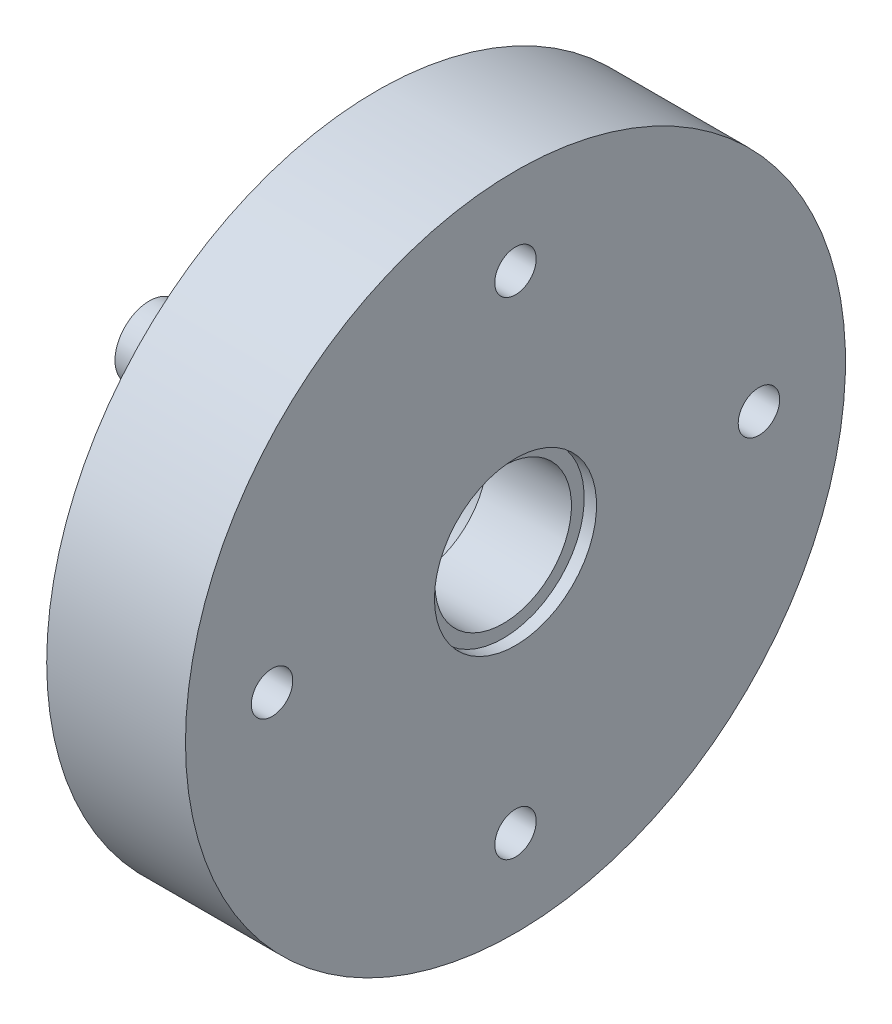
ISO-10303-21;
HEADER;
FILE_DESCRIPTION(('STEP AP214'),'2;1');
FILE_NAME('part.step','',(''),(''),'','','');
FILE_SCHEMA(('AUTOMOTIVE_DESIGN { 1 0 10303 214 1 1 1 1 }'));
ENDSEC;
DATA;
#1=APPLICATION_CONTEXT('core data for automotive mechanical design processes');
#2=APPLICATION_PROTOCOL_DEFINITION('international standard','automotive_design',2000,#1);
#3=PRODUCT_CONTEXT('',#1,'mechanical');
#4=PRODUCT('Part','Part','',(#3));
#5=PRODUCT_RELATED_PRODUCT_CATEGORY('part','',(#4));
#6=PRODUCT_DEFINITION_FORMATION('','',#4);
#7=PRODUCT_DEFINITION_CONTEXT('part definition',#1,'design');
#8=PRODUCT_DEFINITION('design','',#6,#7);
#9=PRODUCT_DEFINITION_SHAPE('','',#8);
#10=(LENGTH_UNIT() NAMED_UNIT(*) SI_UNIT(.MILLI.,.METRE.));
#11=(NAMED_UNIT(*) PLANE_ANGLE_UNIT() SI_UNIT($,.RADIAN.));
#12=(NAMED_UNIT(*) SI_UNIT($,.STERADIAN.) SOLID_ANGLE_UNIT());
#13=UNCERTAINTY_MEASURE_WITH_UNIT(LENGTH_MEASURE(1.E-05),#10,'distance_accuracy_value','');
#14=(GEOMETRIC_REPRESENTATION_CONTEXT(3) GLOBAL_UNCERTAINTY_ASSIGNED_CONTEXT((#13)) GLOBAL_UNIT_ASSIGNED_CONTEXT((#10,
#11,#12)) REPRESENTATION_CONTEXT('',''));
#15=CARTESIAN_POINT('',(0.,0.,0.));
#16=DIRECTION('',(0.,0.,1.));
#17=DIRECTION('',(1.,0.,0.));
#18=AXIS2_PLACEMENT_3D('',#15,#16,#17);
#19=CARTESIAN_POINT('',(-71.2918592683267,11.7141702218951,0.));
#20=DIRECTION('',(1.,0.,0.));
#21=DIRECTION('',(0.,0.,-1.));
#22=AXIS2_PLACEMENT_3D('',#19,#20,#21);
#23=CONICAL_SURFACE('',#22,3.17,0.0784901026373288);
#24=CARTESIAN_POINT('',(-75.7418592683269,11.7141702218951,0.));
#25=DIRECTION('',(-1.,0.,0.));
#26=DIRECTION('',(0.,0.,1.));
#27=AXIS2_PLACEMENT_3D('',#24,#25,#26);
#28=CIRCLE('',#27,2.82);
#29=CARTESIAN_POINT('',(-75.7418592683269,11.7141702218951,2.82));
#30=VERTEX_POINT('',#29);
#31=EDGE_CURVE('E91',#30,#30,#28,.T.);
#32=ORIENTED_EDGE('',*,*,#31,.F.);
#33=EDGE_LOOP('',(#32));
#34=FACE_BOUND('',#33,.T.);
#35=CARTESIAN_POINT('',(-71.2918592683267,11.7141702218951,0.));
#36=DIRECTION('',(-1.,0.,0.));
#37=DIRECTION('',(0.,0.,1.));
#38=AXIS2_PLACEMENT_3D('',#35,#36,#37);
#39=CIRCLE('',#38,3.17);
#40=CARTESIAN_POINT('',(-71.2918592683267,11.7141702218951,3.17));
#41=VERTEX_POINT('',#40);
#42=EDGE_CURVE('E10',#41,#41,#39,.T.);
#43=ORIENTED_EDGE('',*,*,#42,.T.);
#44=EDGE_LOOP('',(#43));
#45=FACE_BOUND('',#44,.T.);
#46=ADVANCED_FACE('F36',(#34,#45),#23,.T.);
#47=CARTESIAN_POINT('',(-71.2918592683267,14.8841702218951,0.));
#48=DIRECTION('',(-1.,0.,0.));
#49=DIRECTION('',(0.,0.,1.));
#50=AXIS2_PLACEMENT_3D('',#47,#48,#49);
#51=PLANE('',#50);
#52=ORIENTED_EDGE('',*,*,#42,.F.);
#53=EDGE_LOOP('',(#52));
#54=FACE_BOUND('',#53,.T.);
#55=CARTESIAN_POINT('',(-71.2918592683267,11.7141702218951,0.));
#56=DIRECTION('',(-1.,0.,0.));
#57=DIRECTION('',(0.,0.,1.));
#58=AXIS2_PLACEMENT_3D('',#55,#56,#57);
#59=CIRCLE('',#58,2.82);
#60=CARTESIAN_POINT('',(-71.2918592683267,11.7141702218951,2.82));
#61=VERTEX_POINT('',#60);
#62=EDGE_CURVE('E42',#61,#61,#59,.T.);
#63=ORIENTED_EDGE('',*,*,#62,.T.);
#64=EDGE_LOOP('',(#63));
#65=FACE_BOUND('',#64,.T.);
#66=ADVANCED_FACE('F223',(#54,#65),#51,.F.);
#67=CARTESIAN_POINT('',(-66.841859268327,11.7141702218951,0.));
#68=DIRECTION('',(1.,0.,0.));
#69=DIRECTION('',(0.,0.,-1.));
#70=AXIS2_PLACEMENT_3D('',#67,#68,#69);
#71=CONICAL_SURFACE('',#70,3.17,0.0784901026373366);
#72=ORIENTED_EDGE('',*,*,#62,.F.);
#73=EDGE_LOOP('',(#72));
#74=FACE_BOUND('',#73,.T.);
#75=CARTESIAN_POINT('',(-66.841859268327,11.7141702218951,0.));
#76=DIRECTION('',(-1.,0.,0.));
#77=DIRECTION('',(0.,0.,1.));
#78=AXIS2_PLACEMENT_3D('',#75,#76,#77);
#79=CIRCLE('',#78,3.17);
#80=CARTESIAN_POINT('',(-66.841859268327,11.7141702218951,3.17));
#81=VERTEX_POINT('',#80);
#82=EDGE_CURVE('E46',#81,#81,#79,.T.);
#83=ORIENTED_EDGE('',*,*,#82,.T.);
#84=EDGE_LOOP('',(#83));
#85=FACE_BOUND('',#84,.T.);
#86=ADVANCED_FACE('F227',(#74,#85),#71,.T.);
#87=CARTESIAN_POINT('',(-66.8418592683269,14.8841702218951,0.));
#88=DIRECTION('',(-1.,0.,0.));
#89=DIRECTION('',(0.,0.,1.));
#90=AXIS2_PLACEMENT_3D('',#87,#88,#89);
#91=PLANE('',#90);
#92=ORIENTED_EDGE('',*,*,#82,.F.);
#93=EDGE_LOOP('',(#92));
#94=FACE_BOUND('',#93,.T.);
#95=CARTESIAN_POINT('',(-66.841859268327,11.7141702218951,0.));
#96=DIRECTION('',(-1.,0.,0.));
#97=DIRECTION('',(0.,0.,1.));
#98=AXIS2_PLACEMENT_3D('',#95,#96,#97);
#99=CIRCLE('',#98,2.82);
#100=CARTESIAN_POINT('',(-66.841859268327,11.7141702218951,2.82));
#101=VERTEX_POINT('',#100);
#102=EDGE_CURVE('E50',#101,#101,#99,.T.);
#103=ORIENTED_EDGE('',*,*,#102,.T.);
#104=EDGE_LOOP('',(#103));
#105=FACE_BOUND('',#104,.T.);
#106=ADVANCED_FACE('F232',(#94,#105),#91,.F.);
#107=CARTESIAN_POINT('',(-62.3716094477877,11.7141702218951,0.));
#108=DIRECTION('',(1.,0.,0.));
#109=DIRECTION('',(0.,0.,-1.));
#110=AXIS2_PLACEMENT_3D('',#107,#108,#109);
#111=CONICAL_SURFACE('',#110,3.17,0.0781359983486207);
#112=ORIENTED_EDGE('',*,*,#102,.F.);
#113=EDGE_LOOP('',(#112));
#114=FACE_BOUND('',#113,.T.);
#115=CARTESIAN_POINT('',(-62.3716094477877,11.7141702218951,0.));
#116=DIRECTION('',(-1.,0.,0.));
#117=DIRECTION('',(0.,0.,1.));
#118=AXIS2_PLACEMENT_3D('',#115,#116,#117);
#119=CIRCLE('',#118,3.17);
#120=CARTESIAN_POINT('',(-62.3716094477877,11.7141702218951,3.17));
#121=VERTEX_POINT('',#120);
#122=EDGE_CURVE('E55',#121,#121,#119,.T.);
#123=ORIENTED_EDGE('',*,*,#122,.T.);
#124=EDGE_LOOP('',(#123));
#125=FACE_BOUND('',#124,.T.);
#126=ADVANCED_FACE('F238',(#114,#125),#111,.T.);
#127=CARTESIAN_POINT('',(-62.3716094477878,14.8841702218951,0.));
#128=DIRECTION('',(-1.,0.,0.));
#129=DIRECTION('',(0.,0.,1.));
#130=AXIS2_PLACEMENT_3D('',#127,#128,#129);
#131=PLANE('',#130);
#132=ORIENTED_EDGE('',*,*,#122,.F.);
#133=EDGE_LOOP('',(#132));
#134=FACE_BOUND('',#133,.T.);
#135=CARTESIAN_POINT('',(-62.3716094477877,11.7141702218951,0.));
#136=DIRECTION('',(-1.,0.,0.));
#137=DIRECTION('',(0.,0.,1.));
#138=AXIS2_PLACEMENT_3D('',#135,#136,#137);
#139=CIRCLE('',#138,2.82);
#140=CARTESIAN_POINT('',(-62.3716094477877,11.7141702218951,-2.82000000000001));
#141=VERTEX_POINT('',#140);
#142=EDGE_CURVE('E58',#141,#141,#139,.T.);
#143=ORIENTED_EDGE('',*,*,#142,.T.);
#144=EDGE_LOOP('',(#143));
#145=FACE_BOUND('',#144,.T.);
#146=ADVANCED_FACE('F242',(#134,#145),#131,.F.);
#147=CARTESIAN_POINT('',(-59.4889180755963,11.7141702218951,0.));
#148=DIRECTION('',(1.,0.,0.));
#149=DIRECTION('',(0.,0.,-1.));
#150=AXIS2_PLACEMENT_3D('',#147,#148,#149);
#151=CONICAL_SURFACE('',#150,12.0738754304226,1.2688119953633);
#152=CARTESIAN_POINT('',(-59.4889180755963,11.7141702218951,0.));
#153=DIRECTION('',(-1.,0.,0.));
#154=DIRECTION('',(0.,0.,1.));
#155=AXIS2_PLACEMENT_3D('',#152,#153,#154);
#156=CIRCLE('',#155,12.0738754304226);
#157=CARTESIAN_POINT('',(-59.4889180755963,11.7141702218951,-12.0738754304226));
#158=VERTEX_POINT('',#157);
#159=EDGE_CURVE('E61',#158,#158,#156,.T.);
#160=CARTESIAN_POINT('',(-62.3716094477877,11.7141702218951,-2.82000000000001));
#161=CARTESIAN_POINT('',(-62.3415814126608,11.7141702218951,-2.91639453573358));
#162=CARTESIAN_POINT('',(-62.3115533775338,11.7141702218951,-3.01278907146714));
#163=CARTESIAN_POINT('',(-62.2514973072798,11.7141702218951,-3.20557814293428));
#164=CARTESIAN_POINT('',(-62.2214692721528,11.7141702218951,-3.30197267866785));
#165=CARTESIAN_POINT('',(-62.1614132018988,11.7141702218951,-3.49476175013499));
#166=CARTESIAN_POINT('',(-62.1313851667718,11.7141702218951,-3.59115628586855));
#167=CARTESIAN_POINT('',(-62.0713290965178,11.7141702218951,-3.78394535733569));
#168=CARTESIAN_POINT('',(-62.0413010613908,11.7141702218951,-3.88033989306926));
#169=CARTESIAN_POINT('',(-61.9812449911368,11.7141702218951,-4.0731289645364));
#170=CARTESIAN_POINT('',(-61.9512169560098,11.7141702218951,-4.16952350026996));
#171=CARTESIAN_POINT('',(-61.8911608857558,11.7141702218951,-4.3623125717371));
#172=CARTESIAN_POINT('',(-61.8611328506288,11.7141702218951,-4.45870710747067));
#173=CARTESIAN_POINT('',(-61.8010767803748,11.7141702218951,-4.6514961789378));
#174=CARTESIAN_POINT('',(-61.7710487452479,11.7141702218951,-4.74789071467137));
#175=CARTESIAN_POINT('',(-61.7109926749939,11.7141702218951,-4.94067978613851));
#176=CARTESIAN_POINT('',(-61.6809646398669,11.7141702218951,-5.03707432187208));
#177=CARTESIAN_POINT('',(-61.6209085696129,11.7141702218951,-5.22986339333921));
#178=CARTESIAN_POINT('',(-61.5908805344859,11.7141702218951,-5.32625792907278));
#179=CARTESIAN_POINT('',(-61.5308244642319,11.7141702218951,-5.51904700053992));
#180=CARTESIAN_POINT('',(-61.5007964291049,11.7141702218951,-5.61544153627349));
#181=CARTESIAN_POINT('',(-61.4407403588509,11.7141702218951,-5.80823060774062));
#182=CARTESIAN_POINT('',(-61.4107123237239,11.7141702218951,-5.90462514347419));
#183=CARTESIAN_POINT('',(-61.3506562534699,11.7141702218951,-6.09741421494133));
#184=CARTESIAN_POINT('',(-61.3206282183429,11.7141702218951,-6.1938087506749));
#185=CARTESIAN_POINT('',(-61.260572148089,11.7141702218951,-6.38659782214203));
#186=CARTESIAN_POINT('',(-61.230544112962,11.7141702218951,-6.4829923578756));
#187=CARTESIAN_POINT('',(-61.170488042708,11.7141702218951,-6.67578142934274));
#188=CARTESIAN_POINT('',(-61.140460007581,11.7141702218951,-6.77217596507631));
#189=CARTESIAN_POINT('',(-61.080403937327,11.7141702218951,-6.96496503654344));
#190=CARTESIAN_POINT('',(-61.0503759022,11.7141702218951,-7.06135957227701));
#191=CARTESIAN_POINT('',(-60.990319831946,11.7141702218951,-7.25414864374415));
#192=CARTESIAN_POINT('',(-60.960291796819,11.7141702218951,-7.35054317947772));
#193=CARTESIAN_POINT('',(-60.900235726565,11.7141702218951,-7.54333225094485));
#194=CARTESIAN_POINT('',(-60.870207691438,11.7141702218951,-7.63972678667842));
#195=CARTESIAN_POINT('',(-60.810151621184,11.7141702218951,-7.83251585814556));
#196=CARTESIAN_POINT('',(-60.7801235860571,11.7141702218951,-7.92891039387913));
#197=CARTESIAN_POINT('',(-60.7200675158031,11.7141702218951,-8.12169946534626));
#198=CARTESIAN_POINT('',(-60.6900394806761,11.7141702218951,-8.21809400107983));
#199=CARTESIAN_POINT('',(-60.6299834104221,11.7141702218951,-8.41088307254697));
#200=CARTESIAN_POINT('',(-60.5999553752951,11.7141702218951,-8.50727760828054));
#201=CARTESIAN_POINT('',(-60.5398993050411,11.7141702218951,-8.70006667974767));
#202=CARTESIAN_POINT('',(-60.5098712699141,11.7141702218951,-8.79646121548124));
#203=CARTESIAN_POINT('',(-60.4498151996601,11.7141702218951,-8.98925028694838));
#204=CARTESIAN_POINT('',(-60.4197871645331,11.7141702218951,-9.08564482268195));
#205=CARTESIAN_POINT('',(-60.3597310942791,11.7141702218951,-9.27843389414908));
#206=CARTESIAN_POINT('',(-60.3297030591521,11.7141702218951,-9.37482842988265));
#207=CARTESIAN_POINT('',(-60.2696469888982,11.7141702218951,-9.56761750134979));
#208=CARTESIAN_POINT('',(-60.2396189537712,11.7141702218951,-9.66401203708335));
#209=CARTESIAN_POINT('',(-60.1795628835172,11.7141702218951,-9.85680110855049));
#210=CARTESIAN_POINT('',(-60.1495348483902,11.7141702218951,-9.95319564428406));
#211=CARTESIAN_POINT('',(-60.0894787781362,11.7141702218951,-10.1459847157512));
#212=CARTESIAN_POINT('',(-60.0594507430092,11.7141702218951,-10.2423792514848));
#213=CARTESIAN_POINT('',(-59.9993946727552,11.7141702218951,-10.4351683229519));
#214=CARTESIAN_POINT('',(-59.9693666376282,11.7141702218951,-10.5315628586855));
#215=CARTESIAN_POINT('',(-59.9093105673742,11.7141702218951,-10.7243519301526));
#216=CARTESIAN_POINT('',(-59.8792825322472,11.7141702218951,-10.8207464658862));
#217=CARTESIAN_POINT('',(-59.8192264619932,11.7141702218951,-11.0135355373533));
#218=CARTESIAN_POINT('',(-59.7891984268662,11.7141702218951,-11.1099300730869));
#219=CARTESIAN_POINT('',(-59.7291423566123,11.7141702218951,-11.302719144554));
#220=CARTESIAN_POINT('',(-59.6991143214853,11.7141702218951,-11.3991136802876));
#221=CARTESIAN_POINT('',(-59.6390582512313,11.7141702218951,-11.5919027517547));
#222=CARTESIAN_POINT('',(-59.6090302161043,11.7141702218951,-11.6882972874883));
#223=CARTESIAN_POINT('',(-59.5489741458503,11.7141702218951,-11.8810863589554));
#224=CARTESIAN_POINT('',(-59.5189461107233,11.7141702218951,-11.977480894689));
#225=CARTESIAN_POINT('',(-59.4889180755963,11.7141702218951,-12.0738754304226));
#226=B_SPLINE_CURVE_WITH_KNOTS('',3,(#160,#161,#162,#163,#164,#165,#166,#167,#168,#169,#170,
#171,#172,#173,#174,#175,#176,#177,#178,#179,#180,#181,#182,#183,#184,#185,#186,#187,#188,#189,
#190,#191,#192,#193,#194,#195,#196,#197,#198,#199,#200,#201,#202,#203,#204,#205,#206,#207,#208,
#209,#210,#211,#212,#213,#214,#215,#216,#217,#218,#219,#220,#221,#222,#223,#224,#225),
.UNSPECIFIED.,.F.,.F.,(4,2,2,2,2,2,2,2,2,2,2,2,2,2,2,2,2,2,2,2,2,2,2,2,2,2,2,2,2,2,2,2,4),(0.,
0.302889921780016,0.605779843560032,0.908669765340045,1.21155968712006,1.51444960890007,
1.81733953068009,2.1202294524601,2.42311937424012,2.72600929602013,3.02889921780015,
3.33178913958016,3.63467906136018,3.93756898314019,4.24045890492021,4.54334882670022,
4.84623874848024,5.14912867026025,5.45201859204027,5.75490851382028,6.0577984356003,
6.36068835738031,6.66357827916033,6.96646820094034,7.26935812272036,7.57224804450037,
7.87513796628039,8.1780278880604,8.48091780984041,8.78380773162043,9.08669765340045,
9.38958757518046,9.69247749696047),.UNSPECIFIED.);
#227=EDGE_CURVE('BSEAM246',#141,#158,#226,.T.);
#228=ORIENTED_EDGE('',*,*,#142,.F.);
#229=ORIENTED_EDGE('',*,*,#159,.T.);
#230=ORIENTED_EDGE('',*,*,#227,.T.);
#231=ORIENTED_EDGE('',*,*,#227,.F.);
#232=EDGE_LOOP('',(#228,#230,#229,#231));
#233=FACE_BOUND('',#232,.T.);
#234=ADVANCED_FACE('F246',(#233),#151,.T.);
#235=CARTESIAN_POINT('',(-795.163849312577,11.7141702218951,0.));
#236=DIRECTION('',(-1.,0.,0.));
#237=DIRECTION('',(0.,0.,1.));
#238=AXIS2_PLACEMENT_3D('',#235,#236,#237);
#239=CYLINDRICAL_SURFACE('',#238,12.0738754304226);
#240=ORIENTED_EDGE('',*,*,#159,.F.);
#241=EDGE_LOOP('',(#240));
#242=FACE_BOUND('',#241,.T.);
#243=CARTESIAN_POINT('',(-57.0912148072447,11.7141702218951,0.));
#244=DIRECTION('',(-1.,0.,0.));
#245=DIRECTION('',(0.,0.,1.));
#246=AXIS2_PLACEMENT_3D('',#243,#244,#245);
#247=CIRCLE('',#246,12.0738754304226);
#248=CARTESIAN_POINT('',(-57.0912148072447,11.7141702218951,12.0738754304226));
#249=VERTEX_POINT('',#248);
#250=EDGE_CURVE('E64',#249,#249,#247,.T.);
#251=ORIENTED_EDGE('',*,*,#250,.T.);
#252=EDGE_LOOP('',(#251));
#253=FACE_BOUND('',#252,.T.);
#254=ADVANCED_FACE('F161',(#242,#253),#239,.T.);
#255=CARTESIAN_POINT('',(-57.0912148072447,38.7880456523176,0.));
#256=DIRECTION('',(1.,0.,0.));
#257=DIRECTION('',(0.,0.,-1.));
#258=AXIS2_PLACEMENT_3D('',#255,#256,#257);
#259=PLANE('',#258);
#260=CARTESIAN_POINT('',(-57.0912148072447,31.6852610835262,0.));
#261=DIRECTION('',(-1.,0.,0.));
#262=DIRECTION('',(0.,0.,1.));
#263=AXIS2_PLACEMENT_3D('',#260,#261,#262);
#264=CIRCLE('',#263,3.275);
#265=CARTESIAN_POINT('',(-57.0912148072447,31.6852610835262,3.275));
#266=VERTEX_POINT('',#265);
#267=EDGE_CURVE('E151',#266,#266,#264,.T.);
#268=ORIENTED_EDGE('',*,*,#267,.F.);
#269=EDGE_LOOP('',(#268));
#270=FACE_BOUND('',#269,.T.);
#271=CARTESIAN_POINT('',(-57.0912148072447,11.7141702218951,19.9710908616312));
#272=DIRECTION('',(-1.,0.,0.));
#273=DIRECTION('',(0.,0.,1.));
#274=AXIS2_PLACEMENT_3D('',#271,#272,#273);
#275=CIRCLE('',#274,3.275);
#276=CARTESIAN_POINT('',(-57.0912148072447,11.7141702218951,23.2460908616312));
#277=VERTEX_POINT('',#276);
#278=EDGE_CURVE('E136',#277,#277,#275,.T.);
#279=ORIENTED_EDGE('',*,*,#278,.F.);
#280=EDGE_LOOP('',(#279));
#281=FACE_BOUND('',#280,.T.);
#282=CARTESIAN_POINT('',(-57.0912148072447,-8.25692063973612,0.));
#283=DIRECTION('',(-1.,0.,0.));
#284=DIRECTION('',(0.,0.,1.));
#285=AXIS2_PLACEMENT_3D('',#282,#283,#284);
#286=CIRCLE('',#285,3.275);
#287=CARTESIAN_POINT('',(-57.0912148072447,-8.25692063973612,3.275));
#288=VERTEX_POINT('',#287);
#289=EDGE_CURVE('E121',#288,#288,#286,.T.);
#290=ORIENTED_EDGE('',*,*,#289,.F.);
#291=EDGE_LOOP('',(#290));
#292=FACE_BOUND('',#291,.T.);
#293=CARTESIAN_POINT('',(-57.0912148072447,11.7141702218951,-19.9710908616312));
#294=DIRECTION('',(-1.,0.,0.));
#295=DIRECTION('',(0.,0.,1.));
#296=AXIS2_PLACEMENT_3D('',#293,#294,#295);
#297=CIRCLE('',#296,3.275);
#298=CARTESIAN_POINT('',(-57.0912148072447,11.7141702218951,-16.6960908616312));
#299=VERTEX_POINT('',#298);
#300=EDGE_CURVE('E106',#299,#299,#297,.T.);
#301=ORIENTED_EDGE('',*,*,#300,.F.);
#302=EDGE_LOOP('',(#301));
#303=FACE_BOUND('',#302,.T.);
#304=ORIENTED_EDGE('',*,*,#250,.F.);
#305=EDGE_LOOP('',(#304));
#306=FACE_BOUND('',#305,.T.);
#307=CARTESIAN_POINT('',(-57.0912148072447,11.7141702218951,0.));
#308=DIRECTION('',(-1.,0.,0.));
#309=DIRECTION('',(0.,0.,1.));
#310=AXIS2_PLACEMENT_3D('',#307,#308,#309);
#311=CIRCLE('',#310,27.0738754304226);
#312=CARTESIAN_POINT('',(-57.0912148072447,11.7141702218951,27.0738754304226));
#313=VERTEX_POINT('',#312);
#314=EDGE_CURVE('E67',#313,#313,#311,.T.);
#315=ORIENTED_EDGE('',*,*,#314,.T.);
#316=EDGE_LOOP('',(#315));
#317=FACE_BOUND('',#316,.T.);
#318=ADVANCED_FACE('F157',(#270,#281,#292,#303,#306,#317),#259,.F.);
#319=CARTESIAN_POINT('',(-795.163849312577,11.7141702218951,0.));
#320=DIRECTION('',(-1.,0.,0.));
#321=DIRECTION('',(0.,0.,1.));
#322=AXIS2_PLACEMENT_3D('',#319,#320,#321);
#323=CYLINDRICAL_SURFACE('',#322,27.0738754304226);
#324=ORIENTED_EDGE('',*,*,#314,.F.);
#325=EDGE_LOOP('',(#324));
#326=FACE_BOUND('',#325,.T.);
#327=CARTESIAN_POINT('',(-45.7058116481793,11.7141702218951,0.));
#328=DIRECTION('',(-1.,0.,0.));
#329=DIRECTION('',(0.,0.,1.));
#330=AXIS2_PLACEMENT_3D('',#327,#328,#329);
#331=CIRCLE('',#330,27.0738754304226);
#332=CARTESIAN_POINT('',(-45.7058116481793,11.7141702218951,27.0738754304226));
#333=VERTEX_POINT('',#332);
#334=EDGE_CURVE('E70',#333,#333,#331,.T.);
#335=ORIENTED_EDGE('',*,*,#334,.T.);
#336=EDGE_LOOP('',(#335));
#337=FACE_BOUND('',#336,.T.);
#338=ADVANCED_FACE('F160',(#326,#337),#323,.T.);
#339=CARTESIAN_POINT('',(-45.7058116481793,19.977485581554,0.));
#340=DIRECTION('',(-1.,0.,0.));
#341=DIRECTION('',(0.,0.,1.));
#342=AXIS2_PLACEMENT_3D('',#339,#340,#341);
#343=PLANE('',#342);
#344=CARTESIAN_POINT('',(-45.7058116481793,31.6852610835262,0.));
#345=DIRECTION('',(-1.,0.,0.));
#346=DIRECTION('',(0.,0.,1.));
#347=AXIS2_PLACEMENT_3D('',#344,#345,#346);
#348=CIRCLE('',#347,1.7);
#349=CARTESIAN_POINT('',(-45.7058116481793,31.6852610835262,1.7));
#350=VERTEX_POINT('',#349);
#351=EDGE_CURVE('E139',#350,#350,#348,.T.);
#352=ORIENTED_EDGE('',*,*,#351,.T.);
#353=EDGE_LOOP('',(#352));
#354=FACE_BOUND('',#353,.T.);
#355=CARTESIAN_POINT('',(-45.7058116481793,11.7141702218951,19.9710908616312));
#356=DIRECTION('',(-1.,0.,0.));
#357=DIRECTION('',(0.,0.,1.));
#358=AXIS2_PLACEMENT_3D('',#355,#356,#357);
#359=CIRCLE('',#358,1.7);
#360=CARTESIAN_POINT('',(-45.7058116481793,11.7141702218951,21.6710908616312));
#361=VERTEX_POINT('',#360);
#362=EDGE_CURVE('E124',#361,#361,#359,.T.);
#363=ORIENTED_EDGE('',*,*,#362,.T.);
#364=EDGE_LOOP('',(#363));
#365=FACE_BOUND('',#364,.T.);
#366=CARTESIAN_POINT('',(-45.7058116481793,-8.25692063973612,0.));
#367=DIRECTION('',(-1.,0.,0.));
#368=DIRECTION('',(0.,0.,1.));
#369=AXIS2_PLACEMENT_3D('',#366,#367,#368);
#370=CIRCLE('',#369,1.7);
#371=CARTESIAN_POINT('',(-45.7058116481793,-8.25692063973612,1.7));
#372=VERTEX_POINT('',#371);
#373=EDGE_CURVE('E109',#372,#372,#370,.T.);
#374=ORIENTED_EDGE('',*,*,#373,.T.);
#375=EDGE_LOOP('',(#374));
#376=FACE_BOUND('',#375,.T.);
#377=CARTESIAN_POINT('',(-45.7058116481793,11.7141702218951,-19.9710908616312));
#378=DIRECTION('',(-1.,0.,0.));
#379=DIRECTION('',(0.,0.,1.));
#380=AXIS2_PLACEMENT_3D('',#377,#378,#379);
#381=CIRCLE('',#380,1.7);
#382=CARTESIAN_POINT('',(-45.7058116481793,11.7141702218951,-18.2710908616312));
#383=VERTEX_POINT('',#382);
#384=EDGE_CURVE('E94',#383,#383,#381,.T.);
#385=ORIENTED_EDGE('',*,*,#384,.T.);
#386=EDGE_LOOP('',(#385));
#387=FACE_BOUND('',#386,.T.);
#388=ORIENTED_EDGE('',*,*,#334,.F.);
#389=EDGE_LOOP('',(#388));
#390=FACE_BOUND('',#389,.T.);
#391=CARTESIAN_POINT('',(-45.7058116481793,11.7141702218951,0.));
#392=DIRECTION('',(-1.,0.,0.));
#393=DIRECTION('',(0.,0.,1.));
#394=AXIS2_PLACEMENT_3D('',#391,#392,#393);
#395=CIRCLE('',#394,6.65);
#396=CARTESIAN_POINT('',(-45.7058116481793,11.7141702218951,6.65));
#397=VERTEX_POINT('',#396);
#398=EDGE_CURVE('E73',#397,#397,#395,.T.);
#399=ORIENTED_EDGE('',*,*,#398,.T.);
#400=EDGE_LOOP('',(#399));
#401=FACE_BOUND('',#400,.T.);
#402=ADVANCED_FACE('F175',(#354,#365,#376,#387,#390,#401),#343,.F.);
#403=CARTESIAN_POINT('',(-795.163849312577,11.7141702218951,0.));
#404=DIRECTION('',(-1.,0.,0.));
#405=DIRECTION('',(0.,0.,1.));
#406=AXIS2_PLACEMENT_3D('',#403,#404,#405);
#407=CYLINDRICAL_SURFACE('',#406,6.65);
#408=ORIENTED_EDGE('',*,*,#398,.F.);
#409=EDGE_LOOP('',(#408));
#410=FACE_BOUND('',#409,.T.);
#411=CARTESIAN_POINT('',(-46.7158116481793,11.7141702218951,0.));
#412=DIRECTION('',(-1.,0.,0.));
#413=DIRECTION('',(0.,0.,1.));
#414=AXIS2_PLACEMENT_3D('',#411,#412,#413);
#415=CIRCLE('',#414,6.65);
#416=CARTESIAN_POINT('',(-46.7158116481793,11.7141702218951,6.65));
#417=VERTEX_POINT('',#416);
#418=EDGE_CURVE('E76',#417,#417,#415,.T.);
#419=ORIENTED_EDGE('',*,*,#418,.T.);
#420=EDGE_LOOP('',(#419));
#421=FACE_BOUND('',#420,.T.);
#422=ADVANCED_FACE('F181',(#410,#421),#407,.F.);
#423=CARTESIAN_POINT('',(-46.7158116481793,18.3641702218951,0.));
#424=DIRECTION('',(-1.,0.,0.));
#425=DIRECTION('',(0.,0.,1.));
#426=AXIS2_PLACEMENT_3D('',#423,#424,#425);
#427=PLANE('',#426);
#428=ORIENTED_EDGE('',*,*,#418,.F.);
#429=EDGE_LOOP('',(#428));
#430=FACE_BOUND('',#429,.T.);
#431=CARTESIAN_POINT('',(-46.7158116481793,11.7141702218951,0.));
#432=DIRECTION('',(-1.,0.,0.));
#433=DIRECTION('',(0.,0.,1.));
#434=AXIS2_PLACEMENT_3D('',#431,#432,#433);
#435=CIRCLE('',#434,5.6);
#436=CARTESIAN_POINT('',(-46.7158116481793,11.7141702218951,5.6));
#437=VERTEX_POINT('',#436);
#438=EDGE_CURVE('E79',#437,#437,#435,.T.);
#439=ORIENTED_EDGE('',*,*,#438,.T.);
#440=EDGE_LOOP('',(#439));
#441=FACE_BOUND('',#440,.T.);
#442=ADVANCED_FACE('F188',(#430,#441),#427,.F.);
#443=CARTESIAN_POINT('',(-795.163849312577,11.7141702218951,0.));
#444=DIRECTION('',(-1.,0.,0.));
#445=DIRECTION('',(0.,0.,1.));
#446=AXIS2_PLACEMENT_3D('',#443,#444,#445);
#447=CYLINDRICAL_SURFACE('',#446,5.6);
#448=ORIENTED_EDGE('',*,*,#438,.F.);
#449=EDGE_LOOP('',(#448));
#450=FACE_BOUND('',#449,.T.);
#451=CARTESIAN_POINT('',(-53.6375454837529,11.7141702218951,0.));
#452=DIRECTION('',(-1.,0.,0.));
#453=DIRECTION('',(0.,0.,1.));
#454=AXIS2_PLACEMENT_3D('',#451,#452,#453);
#455=CIRCLE('',#454,5.6);
#456=CARTESIAN_POINT('',(-53.6375454837529,11.7141702218951,-5.6));
#457=VERTEX_POINT('',#456);
#458=EDGE_CURVE('E82',#457,#457,#455,.T.);
#459=ORIENTED_EDGE('',*,*,#458,.T.);
#460=EDGE_LOOP('',(#459));
#461=FACE_BOUND('',#460,.T.);
#462=ADVANCED_FACE('F194',(#450,#461),#447,.F.);
#463=CARTESIAN_POINT('',(-59.4889180755963,11.7141702218951,0.));
#464=DIRECTION('',(1.,0.,0.));
#465=DIRECTION('',(0.,0.,-1.));
#466=AXIS2_PLACEMENT_3D('',#463,#464,#465);
#467=CONICAL_SURFACE('',#466,1.685,0.589667218314101);
#468=CARTESIAN_POINT('',(-59.4889180755963,11.7141702218951,0.));
#469=DIRECTION('',(-1.,0.,0.));
#470=DIRECTION('',(0.,0.,1.));
#471=AXIS2_PLACEMENT_3D('',#468,#469,#470);
#472=CIRCLE('',#471,1.685);
#473=CARTESIAN_POINT('',(-59.4889180755963,11.7141702218951,-1.685));
#474=VERTEX_POINT('',#473);
#475=EDGE_CURVE('E85',#474,#474,#472,.T.);
#476=CARTESIAN_POINT('',(-53.6375454837529,11.7141702218951,-5.6));
#477=CARTESIAN_POINT('',(-53.6984972815846,11.7141702218951,-5.55921875));
#478=CARTESIAN_POINT('',(-53.7594490794163,11.7141702218951,-5.5184375));
#479=CARTESIAN_POINT('',(-53.8813526750797,11.7141702218951,-5.436875));
#480=CARTESIAN_POINT('',(-53.9423044729114,11.7141702218951,-5.39609375));
#481=CARTESIAN_POINT('',(-54.0642080685748,11.7141702218951,-5.31453125));
#482=CARTESIAN_POINT('',(-54.1251598664065,11.7141702218951,-5.27375));
#483=CARTESIAN_POINT('',(-54.2470634620699,11.7141702218951,-5.1921875));
#484=CARTESIAN_POINT('',(-54.3080152599016,11.7141702218951,-5.15140625));
#485=CARTESIAN_POINT('',(-54.429918855565,11.7141702218951,-5.06984375));
#486=CARTESIAN_POINT('',(-54.4908706533967,11.7141702218951,-5.0290625));
#487=CARTESIAN_POINT('',(-54.6127742490601,11.7141702218951,-4.9475));
#488=CARTESIAN_POINT('',(-54.6737260468918,11.7141702218951,-4.90671875));
#489=CARTESIAN_POINT('',(-54.7956296425552,11.7141702218951,-4.82515625));
#490=CARTESIAN_POINT('',(-54.8565814403869,11.7141702218951,-4.784375));
#491=CARTESIAN_POINT('',(-54.9784850360503,11.7141702218951,-4.7028125));
#492=CARTESIAN_POINT('',(-55.039436833882,11.7141702218951,-4.66203125));
#493=CARTESIAN_POINT('',(-55.1613404295454,11.7141702218951,-4.58046875));
#494=CARTESIAN_POINT('',(-55.2222922273771,11.7141702218951,-4.5396875));
#495=CARTESIAN_POINT('',(-55.3441958230405,11.7141702218951,-4.458125));
#496=CARTESIAN_POINT('',(-55.4051476208722,11.7141702218951,-4.41734375));
#497=CARTESIAN_POINT('',(-55.5270512165357,11.7141702218951,-4.33578125));
#498=CARTESIAN_POINT('',(-55.5880030143674,11.7141702218951,-4.295));
#499=CARTESIAN_POINT('',(-55.7099066100308,11.7141702218951,-4.2134375));
#500=CARTESIAN_POINT('',(-55.7708584078625,11.7141702218951,-4.17265625));
#501=CARTESIAN_POINT('',(-55.8927620035259,11.7141702218951,-4.09109375));
#502=CARTESIAN_POINT('',(-55.9537138013576,11.7141702218951,-4.0503125));
#503=CARTESIAN_POINT('',(-56.075617397021,11.7141702218951,-3.96875));
#504=CARTESIAN_POINT('',(-56.1365691948527,11.7141702218951,-3.92796875));
#505=CARTESIAN_POINT('',(-56.2584727905161,11.7141702218951,-3.84640625));
#506=CARTESIAN_POINT('',(-56.3194245883478,11.7141702218951,-3.805625));
#507=CARTESIAN_POINT('',(-56.4413281840112,11.7141702218951,-3.7240625));
#508=CARTESIAN_POINT('',(-56.5022799818429,11.7141702218951,-3.68328125));
#509=CARTESIAN_POINT('',(-56.6241835775063,11.7141702218951,-3.60171875));
#510=CARTESIAN_POINT('',(-56.685135375338,11.7141702218951,-3.5609375));
#511=CARTESIAN_POINT('',(-56.8070389710014,11.7141702218951,-3.479375));
#512=CARTESIAN_POINT('',(-56.8679907688331,11.7141702218951,-3.43859375));
#513=CARTESIAN_POINT('',(-56.9898943644965,11.7141702218951,-3.35703125));
#514=CARTESIAN_POINT('',(-57.0508461623282,11.7141702218951,-3.31625));
#515=CARTESIAN_POINT('',(-57.1727497579916,11.7141702218951,-3.2346875));
#516=CARTESIAN_POINT('',(-57.2337015558233,11.7141702218951,-3.19390625));
#517=CARTESIAN_POINT('',(-57.3556051514867,11.7141702218951,-3.11234375));
#518=CARTESIAN_POINT('',(-57.4165569493184,11.7141702218951,-3.0715625));
#519=CARTESIAN_POINT('',(-57.5384605449818,11.7141702218951,-2.99));
#520=CARTESIAN_POINT('',(-57.5994123428135,11.7141702218951,-2.94921875));
#521=CARTESIAN_POINT('',(-57.7213159384769,11.7141702218951,-2.86765625));
#522=CARTESIAN_POINT('',(-57.7822677363086,11.7141702218951,-2.826875));
#523=CARTESIAN_POINT('',(-57.904171331972,11.7141702218951,-2.7453125));
#524=CARTESIAN_POINT('',(-57.9651231298038,11.7141702218951,-2.70453125));
#525=CARTESIAN_POINT('',(-58.0870267254672,11.7141702218951,-2.62296875));
#526=CARTESIAN_POINT('',(-58.1479785232989,11.7141702218951,-2.5821875));
#527=CARTESIAN_POINT('',(-58.2698821189623,11.7141702218951,-2.500625));
#528=CARTESIAN_POINT('',(-58.330833916794,11.7141702218951,-2.45984375));
#529=CARTESIAN_POINT('',(-58.4527375124574,11.7141702218951,-2.37828125));
#530=CARTESIAN_POINT('',(-58.5136893102891,11.7141702218951,-2.3375));
#531=CARTESIAN_POINT('',(-58.6355929059525,11.7141702218951,-2.2559375));
#532=CARTESIAN_POINT('',(-58.6965447037842,11.7141702218951,-2.21515625));
#533=CARTESIAN_POINT('',(-58.8184482994476,11.7141702218951,-2.13359375));
#534=CARTESIAN_POINT('',(-58.8794000972793,11.7141702218951,-2.0928125));
#535=CARTESIAN_POINT('',(-59.0013036929427,11.7141702218951,-2.01125));
#536=CARTESIAN_POINT('',(-59.0622554907744,11.7141702218951,-1.97046875));
#537=CARTESIAN_POINT('',(-59.1841590864378,11.7141702218951,-1.88890625));
#538=CARTESIAN_POINT('',(-59.2451108842695,11.7141702218951,-1.848125));
#539=CARTESIAN_POINT('',(-59.3670144799329,11.7141702218951,-1.7665625));
#540=CARTESIAN_POINT('',(-59.4279662777646,11.7141702218951,-1.72578125));
#541=CARTESIAN_POINT('',(-59.4889180755963,11.7141702218951,-1.685));
#542=B_SPLINE_CURVE_WITH_KNOTS('',3,(#476,#477,#478,#479,#480,#481,#482,#483,#484,#485,#486,
#487,#488,#489,#490,#491,#492,#493,#494,#495,#496,#497,#498,#499,#500,#501,#502,#503,#504,#505,
#506,#507,#508,#509,#510,#511,#512,#513,#514,#515,#516,#517,#518,#519,#520,#521,#522,#523,#524,
#525,#526,#527,#528,#529,#530,#531,#532,#533,#534,#535,#536,#537,#538,#539,#540,#541),
.UNSPECIFIED.,.F.,.F.,(4,2,2,2,2,2,2,2,2,2,2,2,2,2,2,2,2,2,2,2,2,2,2,2,2,2,2,2,2,2,2,2,4),(0.,
0.220009290927254,0.440018581854508,0.660027872781761,0.880037163709015,1.10004645463627,
1.32005574556352,1.54006503649078,1.76007432741803,1.98008361834528,2.20009290927254,
2.42010220019979,2.64011149112704,2.8601207820543,3.08013007298155,3.30013936390881,
3.52014865483606,3.74015794576331,3.96016723669057,4.18017652761782,4.40018581854507,
4.62019510947233,4.84020440039958,5.06021369132684,5.28022298225409,5.50023227318134,
5.7202415641086,5.94025085503585,6.1602601459631,6.38026943689036,6.60027872781761,
6.82028801874487,7.04029730967212),.UNSPECIFIED.);
#543=EDGE_CURVE('BSEAM200',#457,#474,#542,.T.);
#544=ORIENTED_EDGE('',*,*,#458,.F.);
#545=ORIENTED_EDGE('',*,*,#475,.T.);
#546=ORIENTED_EDGE('',*,*,#543,.T.);
#547=ORIENTED_EDGE('',*,*,#543,.F.);
#548=EDGE_LOOP('',(#544,#546,#545,#547));
#549=FACE_BOUND('',#548,.T.);
#550=ADVANCED_FACE('F200',(#549),#467,.F.);
#551=CARTESIAN_POINT('',(-795.163849312577,11.7141702218951,0.));
#552=DIRECTION('',(-1.,0.,0.));
#553=DIRECTION('',(0.,0.,1.));
#554=AXIS2_PLACEMENT_3D('',#551,#552,#553);
#555=CYLINDRICAL_SURFACE('',#554,1.685);
#556=ORIENTED_EDGE('',*,*,#475,.F.);
#557=EDGE_LOOP('',(#556));
#558=FACE_BOUND('',#557,.T.);
#559=CARTESIAN_POINT('',(-75.7418592683269,11.7141702218951,0.));
#560=DIRECTION('',(-1.,0.,0.));
#561=DIRECTION('',(0.,0.,1.));
#562=AXIS2_PLACEMENT_3D('',#559,#560,#561);
#563=CIRCLE('',#562,1.685);
#564=CARTESIAN_POINT('',(-75.7418592683269,11.7141702218951,1.685));
#565=VERTEX_POINT('',#564);
#566=EDGE_CURVE('E88',#565,#565,#563,.T.);
#567=ORIENTED_EDGE('',*,*,#566,.T.);
#568=EDGE_LOOP('',(#567));
#569=FACE_BOUND('',#568,.T.);
#570=ADVANCED_FACE('F206',(#558,#569),#555,.F.);
#571=CARTESIAN_POINT('',(-75.7418592683269,13.3991702218951,0.));
#572=DIRECTION('',(1.,0.,0.));
#573=DIRECTION('',(0.,0.,-1.));
#574=AXIS2_PLACEMENT_3D('',#571,#572,#573);
#575=PLANE('',#574);
#576=ORIENTED_EDGE('',*,*,#566,.F.);
#577=EDGE_LOOP('',(#576));
#578=FACE_BOUND('',#577,.T.);
#579=ORIENTED_EDGE('',*,*,#31,.T.);
#580=EDGE_LOOP('',(#579));
#581=FACE_BOUND('',#580,.T.);
#582=ADVANCED_FACE('F212',(#578,#581),#575,.F.);
#583=CARTESIAN_POINT('',(-57.0912148072447,11.7141702218951,-19.9710908616312));
#584=DIRECTION('',(-1.,0.,0.));
#585=DIRECTION('',(0.,0.,1.));
#586=AXIS2_PLACEMENT_3D('',#583,#584,#585);
#587=CYLINDRICAL_SURFACE('',#586,1.7);
#588=ORIENTED_EDGE('',*,*,#384,.F.);
#589=EDGE_LOOP('',(#588));
#590=FACE_BOUND('',#589,.T.);
#591=CARTESIAN_POINT('',(-53.6912148072447,11.7141702218951,-19.9710908616312));
#592=DIRECTION('',(-1.,0.,0.));
#593=DIRECTION('',(0.,0.,1.));
#594=AXIS2_PLACEMENT_3D('',#591,#592,#593);
#595=CIRCLE('',#594,1.7);
#596=CARTESIAN_POINT('',(-53.6912148072447,11.7141702218951,-18.2710908616312));
#597=VERTEX_POINT('',#596);
#598=EDGE_CURVE('E97',#597,#597,#595,.T.);
#599=ORIENTED_EDGE('',*,*,#598,.T.);
#600=EDGE_LOOP('',(#599));
#601=FACE_BOUND('',#600,.T.);
#602=ADVANCED_FACE('F218',(#590,#601),#587,.F.);
#603=CARTESIAN_POINT('',(-53.6912148072447,14.9641702218951,-19.9710908616312));
#604=DIRECTION('',(1.,0.,0.));
#605=DIRECTION('',(0.,0.,-1.));
#606=AXIS2_PLACEMENT_3D('',#603,#604,#605);
#607=PLANE('',#606);
#608=ORIENTED_EDGE('',*,*,#598,.F.);
#609=EDGE_LOOP('',(#608));
#610=FACE_BOUND('',#609,.T.);
#611=CARTESIAN_POINT('',(-53.6912148072447,11.7141702218951,-19.9710908616312));
#612=DIRECTION('',(-1.,0.,0.));
#613=DIRECTION('',(0.,0.,1.));
#614=AXIS2_PLACEMENT_3D('',#611,#612,#613);
#615=CIRCLE('',#614,3.25);
#616=CARTESIAN_POINT('',(-53.6912148072447,11.7141702218951,-16.7210908616312));
#617=VERTEX_POINT('',#616);
#618=EDGE_CURVE('E100',#617,#617,#615,.T.);
#619=ORIENTED_EDGE('',*,*,#618,.T.);
#620=EDGE_LOOP('',(#619));
#621=FACE_BOUND('',#620,.T.);
#622=ADVANCED_FACE('F256',(#610,#621),#607,.F.);
#623=CARTESIAN_POINT('',(-57.0912148072447,11.7141702218951,-19.9710908616312));
#624=DIRECTION('',(-1.,0.,0.));
#625=DIRECTION('',(0.,0.,1.));
#626=AXIS2_PLACEMENT_3D('',#623,#624,#625);
#627=CYLINDRICAL_SURFACE('',#626,3.25);
#628=ORIENTED_EDGE('',*,*,#618,.F.);
#629=EDGE_LOOP('',(#628));
#630=FACE_BOUND('',#629,.T.);
#631=CARTESIAN_POINT('',(-57.0662148072447,11.7141702218951,-19.9710908616312));
#632=DIRECTION('',(-1.,0.,0.));
#633=DIRECTION('',(0.,0.,1.));
#634=AXIS2_PLACEMENT_3D('',#631,#632,#633);
#635=CIRCLE('',#634,3.25);
#636=CARTESIAN_POINT('',(-57.0662148072447,11.7141702218951,-16.7210908616312));
#637=VERTEX_POINT('',#636);
#638=EDGE_CURVE('E103',#637,#637,#635,.T.);
#639=ORIENTED_EDGE('',*,*,#638,.T.);
#640=EDGE_LOOP('',(#639));
#641=FACE_BOUND('',#640,.T.);
#642=ADVANCED_FACE('F260',(#630,#641),#627,.F.);
#643=CARTESIAN_POINT('',(-57.0912148072447,11.7141702218951,-19.9710908616312));
#644=DIRECTION('',(-1.,0.,0.));
#645=DIRECTION('',(0.,0.,1.));
#646=AXIS2_PLACEMENT_3D('',#643,#644,#645);
#647=CONICAL_SURFACE('',#646,3.275,0.785398163397518);
#648=ORIENTED_EDGE('',*,*,#638,.F.);
#649=EDGE_LOOP('',(#648));
#650=FACE_BOUND('',#649,.T.);
#651=ORIENTED_EDGE('',*,*,#300,.T.);
#652=EDGE_LOOP('',(#651));
#653=FACE_BOUND('',#652,.T.);
#654=ADVANCED_FACE('F264',(#650,#653),#647,.F.);
#655=CARTESIAN_POINT('',(-57.0912148072447,-8.25692063973612,0.));
#656=DIRECTION('',(-1.,0.,0.));
#657=DIRECTION('',(0.,0.,1.));
#658=AXIS2_PLACEMENT_3D('',#655,#656,#657);
#659=CYLINDRICAL_SURFACE('',#658,1.7);
#660=ORIENTED_EDGE('',*,*,#373,.F.);
#661=EDGE_LOOP('',(#660));
#662=FACE_BOUND('',#661,.T.);
#663=CARTESIAN_POINT('',(-53.6912148072447,-8.25692063973612,0.));
#664=DIRECTION('',(-1.,0.,0.));
#665=DIRECTION('',(0.,0.,1.));
#666=AXIS2_PLACEMENT_3D('',#663,#664,#665);
#667=CIRCLE('',#666,1.7);
#668=CARTESIAN_POINT('',(-53.6912148072447,-8.25692063973612,1.7));
#669=VERTEX_POINT('',#668);
#670=EDGE_CURVE('E112',#669,#669,#667,.T.);
#671=ORIENTED_EDGE('',*,*,#670,.T.);
#672=EDGE_LOOP('',(#671));
#673=FACE_BOUND('',#672,.T.);
#674=ADVANCED_FACE('F268',(#662,#673),#659,.F.);
#675=CARTESIAN_POINT('',(-53.6912148072447,-5.00692063973612,0.));
#676=DIRECTION('',(1.,0.,0.));
#677=DIRECTION('',(0.,0.,-1.));
#678=AXIS2_PLACEMENT_3D('',#675,#676,#677);
#679=PLANE('',#678);
#680=ORIENTED_EDGE('',*,*,#670,.F.);
#681=EDGE_LOOP('',(#680));
#682=FACE_BOUND('',#681,.T.);
#683=CARTESIAN_POINT('',(-53.6912148072447,-8.25692063973612,0.));
#684=DIRECTION('',(-1.,0.,0.));
#685=DIRECTION('',(0.,0.,1.));
#686=AXIS2_PLACEMENT_3D('',#683,#684,#685);
#687=CIRCLE('',#686,3.25);
#688=CARTESIAN_POINT('',(-53.6912148072447,-8.25692063973612,3.25));
#689=VERTEX_POINT('',#688);
#690=EDGE_CURVE('E115',#689,#689,#687,.T.);
#691=ORIENTED_EDGE('',*,*,#690,.T.);
#692=EDGE_LOOP('',(#691));
#693=FACE_BOUND('',#692,.T.);
#694=ADVANCED_FACE('F272',(#682,#693),#679,.F.);
#695=CARTESIAN_POINT('',(-57.0912148072447,-8.25692063973612,0.));
#696=DIRECTION('',(-1.,0.,0.));
#697=DIRECTION('',(0.,0.,1.));
#698=AXIS2_PLACEMENT_3D('',#695,#696,#697);
#699=CYLINDRICAL_SURFACE('',#698,3.25);
#700=ORIENTED_EDGE('',*,*,#690,.F.);
#701=EDGE_LOOP('',(#700));
#702=FACE_BOUND('',#701,.T.);
#703=CARTESIAN_POINT('',(-57.0662148072447,-8.25692063973612,0.));
#704=DIRECTION('',(-1.,0.,0.));
#705=DIRECTION('',(0.,0.,1.));
#706=AXIS2_PLACEMENT_3D('',#703,#704,#705);
#707=CIRCLE('',#706,3.25);
#708=CARTESIAN_POINT('',(-57.0662148072447,-8.25692063973612,3.25));
#709=VERTEX_POINT('',#708);
#710=EDGE_CURVE('E118',#709,#709,#707,.T.);
#711=ORIENTED_EDGE('',*,*,#710,.T.);
#712=EDGE_LOOP('',(#711));
#713=FACE_BOUND('',#712,.T.);
#714=ADVANCED_FACE('F276',(#702,#713),#699,.F.);
#715=CARTESIAN_POINT('',(-57.0912148072447,-8.25692063973612,0.));
#716=DIRECTION('',(-1.,0.,0.));
#717=DIRECTION('',(0.,0.,1.));
#718=AXIS2_PLACEMENT_3D('',#715,#716,#717);
#719=CONICAL_SURFACE('',#718,3.275,0.785398163397518);
#720=ORIENTED_EDGE('',*,*,#710,.F.);
#721=EDGE_LOOP('',(#720));
#722=FACE_BOUND('',#721,.T.);
#723=ORIENTED_EDGE('',*,*,#289,.T.);
#724=EDGE_LOOP('',(#723));
#725=FACE_BOUND('',#724,.T.);
#726=ADVANCED_FACE('F280',(#722,#725),#719,.F.);
#727=CARTESIAN_POINT('',(-57.0912148072447,11.7141702218951,19.9710908616312));
#728=DIRECTION('',(-1.,0.,0.));
#729=DIRECTION('',(0.,0.,1.));
#730=AXIS2_PLACEMENT_3D('',#727,#728,#729);
#731=CYLINDRICAL_SURFACE('',#730,1.7);
#732=ORIENTED_EDGE('',*,*,#362,.F.);
#733=EDGE_LOOP('',(#732));
#734=FACE_BOUND('',#733,.T.);
#735=CARTESIAN_POINT('',(-53.6912148072447,11.7141702218951,19.9710908616312));
#736=DIRECTION('',(-1.,0.,0.));
#737=DIRECTION('',(0.,0.,1.));
#738=AXIS2_PLACEMENT_3D('',#735,#736,#737);
#739=CIRCLE('',#738,1.7);
#740=CARTESIAN_POINT('',(-53.6912148072447,11.7141702218951,21.6710908616312));
#741=VERTEX_POINT('',#740);
#742=EDGE_CURVE('E127',#741,#741,#739,.T.);
#743=ORIENTED_EDGE('',*,*,#742,.T.);
#744=EDGE_LOOP('',(#743));
#745=FACE_BOUND('',#744,.T.);
#746=ADVANCED_FACE('F284',(#734,#745),#731,.F.);
#747=CARTESIAN_POINT('',(-53.6912148072447,14.9641702218951,19.9710908616312));
#748=DIRECTION('',(1.,0.,0.));
#749=DIRECTION('',(0.,0.,-1.));
#750=AXIS2_PLACEMENT_3D('',#747,#748,#749);
#751=PLANE('',#750);
#752=ORIENTED_EDGE('',*,*,#742,.F.);
#753=EDGE_LOOP('',(#752));
#754=FACE_BOUND('',#753,.T.);
#755=CARTESIAN_POINT('',(-53.6912148072447,11.7141702218951,19.9710908616312));
#756=DIRECTION('',(-1.,0.,0.));
#757=DIRECTION('',(0.,0.,1.));
#758=AXIS2_PLACEMENT_3D('',#755,#756,#757);
#759=CIRCLE('',#758,3.25);
#760=CARTESIAN_POINT('',(-53.6912148072447,11.7141702218951,23.2210908616312));
#761=VERTEX_POINT('',#760);
#762=EDGE_CURVE('E130',#761,#761,#759,.T.);
#763=ORIENTED_EDGE('',*,*,#762,.T.);
#764=EDGE_LOOP('',(#763));
#765=FACE_BOUND('',#764,.T.);
#766=ADVANCED_FACE('F288',(#754,#765),#751,.F.);
#767=CARTESIAN_POINT('',(-57.0912148072447,11.7141702218951,19.9710908616312));
#768=DIRECTION('',(-1.,0.,0.));
#769=DIRECTION('',(0.,0.,1.));
#770=AXIS2_PLACEMENT_3D('',#767,#768,#769);
#771=CYLINDRICAL_SURFACE('',#770,3.25);
#772=ORIENTED_EDGE('',*,*,#762,.F.);
#773=EDGE_LOOP('',(#772));
#774=FACE_BOUND('',#773,.T.);
#775=CARTESIAN_POINT('',(-57.0662148072447,11.7141702218951,19.9710908616312));
#776=DIRECTION('',(-1.,0.,0.));
#777=DIRECTION('',(0.,0.,1.));
#778=AXIS2_PLACEMENT_3D('',#775,#776,#777);
#779=CIRCLE('',#778,3.25);
#780=CARTESIAN_POINT('',(-57.0662148072447,11.7141702218951,23.2210908616312));
#781=VERTEX_POINT('',#780);
#782=EDGE_CURVE('E133',#781,#781,#779,.T.);
#783=ORIENTED_EDGE('',*,*,#782,.T.);
#784=EDGE_LOOP('',(#783));
#785=FACE_BOUND('',#784,.T.);
#786=ADVANCED_FACE('F292',(#774,#785),#771,.F.);
#787=CARTESIAN_POINT('',(-57.0912148072447,11.7141702218951,19.9710908616312));
#788=DIRECTION('',(-1.,0.,0.));
#789=DIRECTION('',(0.,0.,1.));
#790=AXIS2_PLACEMENT_3D('',#787,#788,#789);
#791=CONICAL_SURFACE('',#790,3.275,0.785398163397518);
#792=ORIENTED_EDGE('',*,*,#782,.F.);
#793=EDGE_LOOP('',(#792));
#794=FACE_BOUND('',#793,.T.);
#795=ORIENTED_EDGE('',*,*,#278,.T.);
#796=EDGE_LOOP('',(#795));
#797=FACE_BOUND('',#796,.T.);
#798=ADVANCED_FACE('F296',(#794,#797),#791,.F.);
#799=CARTESIAN_POINT('',(-57.0912148072447,31.6852610835262,0.));
#800=DIRECTION('',(-1.,0.,0.));
#801=DIRECTION('',(0.,0.,1.));
#802=AXIS2_PLACEMENT_3D('',#799,#800,#801);
#803=CYLINDRICAL_SURFACE('',#802,1.7);
#804=ORIENTED_EDGE('',*,*,#351,.F.);
#805=EDGE_LOOP('',(#804));
#806=FACE_BOUND('',#805,.T.);
#807=CARTESIAN_POINT('',(-53.6912148072447,31.6852610835262,0.));
#808=DIRECTION('',(-1.,0.,0.));
#809=DIRECTION('',(0.,0.,1.));
#810=AXIS2_PLACEMENT_3D('',#807,#808,#809);
#811=CIRCLE('',#810,1.7);
#812=CARTESIAN_POINT('',(-53.6912148072447,31.6852610835262,1.7));
#813=VERTEX_POINT('',#812);
#814=EDGE_CURVE('E142',#813,#813,#811,.T.);
#815=ORIENTED_EDGE('',*,*,#814,.T.);
#816=EDGE_LOOP('',(#815));
#817=FACE_BOUND('',#816,.T.);
#818=ADVANCED_FACE('F300',(#806,#817),#803,.F.);
#819=CARTESIAN_POINT('',(-53.6912148072447,34.9352610835262,0.));
#820=DIRECTION('',(1.,0.,0.));
#821=DIRECTION('',(0.,0.,-1.));
#822=AXIS2_PLACEMENT_3D('',#819,#820,#821);
#823=PLANE('',#822);
#824=ORIENTED_EDGE('',*,*,#814,.F.);
#825=EDGE_LOOP('',(#824));
#826=FACE_BOUND('',#825,.T.);
#827=CARTESIAN_POINT('',(-53.6912148072447,31.6852610835262,0.));
#828=DIRECTION('',(-1.,0.,0.));
#829=DIRECTION('',(0.,0.,1.));
#830=AXIS2_PLACEMENT_3D('',#827,#828,#829);
#831=CIRCLE('',#830,3.25);
#832=CARTESIAN_POINT('',(-53.6912148072447,31.6852610835262,3.25));
#833=VERTEX_POINT('',#832);
#834=EDGE_CURVE('E145',#833,#833,#831,.T.);
#835=ORIENTED_EDGE('',*,*,#834,.T.);
#836=EDGE_LOOP('',(#835));
#837=FACE_BOUND('',#836,.T.);
#838=ADVANCED_FACE('F304',(#826,#837),#823,.F.);
#839=CARTESIAN_POINT('',(-57.0912148072447,31.6852610835262,0.));
#840=DIRECTION('',(-1.,0.,0.));
#841=DIRECTION('',(0.,0.,1.));
#842=AXIS2_PLACEMENT_3D('',#839,#840,#841);
#843=CYLINDRICAL_SURFACE('',#842,3.25);
#844=ORIENTED_EDGE('',*,*,#834,.F.);
#845=EDGE_LOOP('',(#844));
#846=FACE_BOUND('',#845,.T.);
#847=CARTESIAN_POINT('',(-57.0662148072447,31.6852610835262,0.));
#848=DIRECTION('',(-1.,0.,0.));
#849=DIRECTION('',(0.,0.,1.));
#850=AXIS2_PLACEMENT_3D('',#847,#848,#849);
#851=CIRCLE('',#850,3.25);
#852=CARTESIAN_POINT('',(-57.0662148072447,31.6852610835262,3.25));
#853=VERTEX_POINT('',#852);
#854=EDGE_CURVE('E148',#853,#853,#851,.T.);
#855=ORIENTED_EDGE('',*,*,#854,.T.);
#856=EDGE_LOOP('',(#855));
#857=FACE_BOUND('',#856,.T.);
#858=ADVANCED_FACE('F308',(#846,#857),#843,.F.);
#859=CARTESIAN_POINT('',(-57.0912148072447,31.6852610835262,0.));
#860=DIRECTION('',(-1.,0.,0.));
#861=DIRECTION('',(0.,0.,1.));
#862=AXIS2_PLACEMENT_3D('',#859,#860,#861);
#863=CONICAL_SURFACE('',#862,3.275,0.785398163397448);
#864=ORIENTED_EDGE('',*,*,#854,.F.);
#865=EDGE_LOOP('',(#864));
#866=FACE_BOUND('',#865,.T.);
#867=ORIENTED_EDGE('',*,*,#267,.T.);
#868=EDGE_LOOP('',(#867));
#869=FACE_BOUND('',#868,.T.);
#870=ADVANCED_FACE('F155',(#866,#869),#863,.F.);
#871=CLOSED_SHELL('',(#46,#66,#86,#106,#126,#146,#234,#254,#318,#338,#402,#422,#442,#462,#550,
#570,#582,#602,#622,#642,#654,#674,#694,#714,#726,#746,#766,#786,#798,#818,#838,#858,#870));
#872=MANIFOLD_SOLID_BREP('B2',#871);
#873=ADVANCED_BREP_SHAPE_REPRESENTATION('',(#18,#872),#14);
#874=SHAPE_DEFINITION_REPRESENTATION(#9,#873);
ENDSEC;
END-ISO-10303-21;
